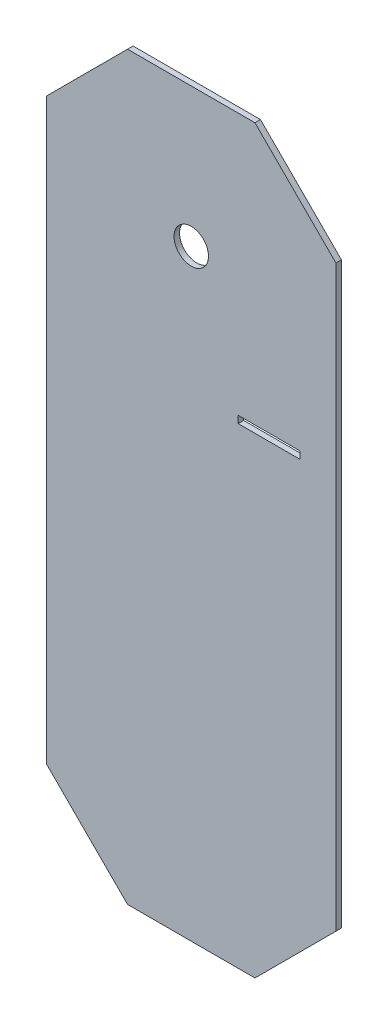
ISO-10303-21;
HEADER;
FILE_DESCRIPTION(('STEP AP214'),'2;1');
FILE_NAME('part.step','',(''),(''),'','','');
FILE_SCHEMA(('AUTOMOTIVE_DESIGN { 1 0 10303 214 1 1 1 1 }'));
ENDSEC;
DATA;
#1=APPLICATION_CONTEXT('core data for automotive mechanical design processes');
#2=APPLICATION_PROTOCOL_DEFINITION('international standard','automotive_design',2000,#1);
#3=PRODUCT_CONTEXT('',#1,'mechanical');
#4=PRODUCT('Part','Part','',(#3));
#5=PRODUCT_RELATED_PRODUCT_CATEGORY('part','',(#4));
#6=PRODUCT_DEFINITION_FORMATION('','',#4);
#7=PRODUCT_DEFINITION_CONTEXT('part definition',#1,'design');
#8=PRODUCT_DEFINITION('design','',#6,#7);
#9=PRODUCT_DEFINITION_SHAPE('','',#8);
#10=(LENGTH_UNIT() NAMED_UNIT(*) SI_UNIT(.MILLI.,.METRE.));
#11=(NAMED_UNIT(*) PLANE_ANGLE_UNIT() SI_UNIT($,.RADIAN.));
#12=(NAMED_UNIT(*) SI_UNIT($,.STERADIAN.) SOLID_ANGLE_UNIT());
#13=UNCERTAINTY_MEASURE_WITH_UNIT(LENGTH_MEASURE(1.E-05),#10,'distance_accuracy_value','');
#14=(GEOMETRIC_REPRESENTATION_CONTEXT(3) GLOBAL_UNCERTAINTY_ASSIGNED_CONTEXT((#13)) GLOBAL_UNIT_ASSIGNED_CONTEXT((#10,
#11,#12)) REPRESENTATION_CONTEXT('',''));
#15=CARTESIAN_POINT('',(0.,0.,0.));
#16=DIRECTION('',(0.,0.,1.));
#17=DIRECTION('',(1.,0.,0.));
#18=AXIS2_PLACEMENT_3D('',#15,#16,#17);
#19=CARTESIAN_POINT('',(-105.,640.774079522774,4.));
#20=DIRECTION('',(0.,0.,1.));
#21=DIRECTION('',(1.,0.,0.));
#22=AXIS2_PLACEMENT_3D('',#19,#20,#21);
#23=PLANE('',#22);
#24=DIRECTION('',(0.,1.,0.));
#25=VECTOR('',#24,1.);
#26=CARTESIAN_POINT('',(79.031307539577,445.574029202641,4.));
#27=LINE('',#26,#25);
#28=CARTESIAN_POINT('',(79.031307539577,445.574029202641,4.));
#29=VERTEX_POINT('',#28);
#30=CARTESIAN_POINT('',(79.031307539577,450.824029202642,4.));
#31=VERTEX_POINT('',#30);
#32=EDGE_CURVE('E45',#29,#31,#27,.T.);
#33=ORIENTED_EDGE('',*,*,#32,.F.);
#34=DIRECTION('',(1.,0.,0.));
#35=VECTOR('',#34,1.);
#36=CARTESIAN_POINT('',(34.031307539577,445.574029202641,4.));
#37=LINE('',#36,#35);
#38=CARTESIAN_POINT('',(34.031307539577,445.574029202641,4.));
#39=VERTEX_POINT('',#38);
#40=EDGE_CURVE('E137',#39,#29,#37,.T.);
#41=ORIENTED_EDGE('',*,*,#40,.F.);
#42=DIRECTION('',(0.,-1.,0.));
#43=VECTOR('',#42,1.);
#44=CARTESIAN_POINT('',(34.031307539577,445.574029202641,4.));
#45=LINE('',#44,#43);
#46=CARTESIAN_POINT('',(34.031307539577,450.824029202642,4.));
#47=VERTEX_POINT('',#46);
#48=EDGE_CURVE('E140',#47,#39,#45,.T.);
#49=ORIENTED_EDGE('',*,*,#48,.F.);
#50=DIRECTION('',(-1.,0.,0.));
#51=VECTOR('',#50,1.);
#52=CARTESIAN_POINT('',(34.031307539577,450.824029202642,4.));
#53=LINE('',#52,#51);
#54=EDGE_CURVE('E146',#31,#47,#53,.T.);
#55=ORIENTED_EDGE('',*,*,#54,.F.);
#56=EDGE_LOOP('',(#33,#41,#49,#55));
#57=FACE_BOUND('',#56,.T.);
#58=DIRECTION('',(0.,-1.,0.));
#59=VECTOR('',#58,1.);
#60=CARTESIAN_POINT('',(-105.,539.996445797992,4.));
#61=LINE('',#60,#59);
#62=CARTESIAN_POINT('',(-105.,581.996445797992,4.));
#63=VERTEX_POINT('',#62);
#64=CARTESIAN_POINT('',(-105.,161.993882509536,4.));
#65=VERTEX_POINT('',#64);
#66=EDGE_CURVE('E162',#63,#65,#61,.T.);
#67=ORIENTED_EDGE('',*,*,#66,.T.);
#68=DIRECTION('',(0.707106781186548,-0.707106781186547,0.));
#69=VECTOR('',#68,1.);
#70=CARTESIAN_POINT('',(-105.,161.993882509536,4.));
#71=LINE('',#70,#69);
#72=CARTESIAN_POINT('',(-46.2223662752187,103.216248784755,4.));
#73=VERTEX_POINT('',#72);
#74=EDGE_CURVE('E164',#65,#73,#71,.T.);
#75=ORIENTED_EDGE('',*,*,#74,.T.);
#76=DIRECTION('',(1.,0.,0.));
#77=VECTOR('',#76,1.);
#78=CARTESIAN_POINT('',(46.2223662752186,103.216248784755,4.));
#79=LINE('',#78,#77);
#80=CARTESIAN_POINT('',(46.2223662752186,103.216248784755,4.));
#81=VERTEX_POINT('',#80);
#82=EDGE_CURVE('E167',#73,#81,#79,.T.);
#83=ORIENTED_EDGE('',*,*,#82,.T.);
#84=DIRECTION('',(0.707106781186548,0.707106781186547,0.));
#85=VECTOR('',#84,1.);
#86=CARTESIAN_POINT('',(105.,161.993882509536,4.));
#87=LINE('',#86,#85);
#88=CARTESIAN_POINT('',(105.,161.993882509536,4.));
#89=VERTEX_POINT('',#88);
#90=EDGE_CURVE('E169',#81,#89,#87,.T.);
#91=ORIENTED_EDGE('',*,*,#90,.T.);
#92=DIRECTION('',(0.,1.,0.));
#93=VECTOR('',#92,1.);
#94=CARTESIAN_POINT('',(105.,203.993882509536,4.));
#95=LINE('',#94,#93);
#96=CARTESIAN_POINT('',(105.,581.996445797992,4.));
#97=VERTEX_POINT('',#96);
#98=EDGE_CURVE('E171',#89,#97,#95,.T.);
#99=ORIENTED_EDGE('',*,*,#98,.T.);
#100=DIRECTION('',(-0.707106781186548,0.707106781186547,0.));
#101=VECTOR('',#100,1.);
#102=CARTESIAN_POINT('',(105.,581.996445797992,4.));
#103=LINE('',#102,#101);
#104=CARTESIAN_POINT('',(46.2223662752186,640.774079522774,4.));
#105=VERTEX_POINT('',#104);
#106=EDGE_CURVE('E173',#97,#105,#103,.T.);
#107=ORIENTED_EDGE('',*,*,#106,.T.);
#108=DIRECTION('',(-1.,0.,0.));
#109=VECTOR('',#108,1.);
#110=CARTESIAN_POINT('',(46.2223662752186,640.774079522774,4.));
#111=LINE('',#110,#109);
#112=CARTESIAN_POINT('',(-46.2223662752187,640.774079522774,4.));
#113=VERTEX_POINT('',#112);
#114=EDGE_CURVE('E175',#105,#113,#111,.T.);
#115=ORIENTED_EDGE('',*,*,#114,.T.);
#116=DIRECTION('',(-0.707106781186548,-0.707106781186547,0.));
#117=VECTOR('',#116,1.);
#118=CARTESIAN_POINT('',(-105.,581.996445797992,4.));
#119=LINE('',#118,#117);
#120=EDGE_CURVE('E177',#113,#63,#119,.T.);
#121=ORIENTED_EDGE('',*,*,#120,.T.);
#122=EDGE_LOOP('',(#67,#75,#83,#91,#99,#107,#115,#121));
#123=FACE_BOUND('',#122,.T.);
#124=CARTESIAN_POINT('',(0.,539.996445797992,4.));
#125=DIRECTION('',(0.,0.,1.));
#126=DIRECTION('',(1.,0.,0.));
#127=AXIS2_PLACEMENT_3D('',#124,#125,#126);
#128=CIRCLE('',#127,12.5);
#129=CARTESIAN_POINT('',(12.5,539.996445797992,4.));
#130=VERTEX_POINT('',#129);
#131=EDGE_CURVE('E156',#130,#130,#128,.T.);
#132=ORIENTED_EDGE('',*,*,#131,.F.);
#133=EDGE_LOOP('',(#132));
#134=FACE_BOUND('',#133,.T.);
#135=ADVANCED_FACE('F30',(#57,#123,#134),#23,.T.);
#136=CARTESIAN_POINT('',(-105.,640.774079522774,0.));
#137=DIRECTION('',(0.,0.,1.));
#138=DIRECTION('',(1.,0.,0.));
#139=AXIS2_PLACEMENT_3D('',#136,#137,#138);
#140=PLANE('',#139);
#141=DIRECTION('',(1.,0.,0.));
#142=VECTOR('',#141,1.);
#143=CARTESIAN_POINT('',(34.031307539577,445.574029202641,0.));
#144=LINE('',#143,#142);
#145=CARTESIAN_POINT('',(34.031307539577,445.574029202641,0.));
#146=VERTEX_POINT('',#145);
#147=CARTESIAN_POINT('',(79.031307539577,445.574029202641,0.));
#148=VERTEX_POINT('',#147);
#149=EDGE_CURVE('E127',#146,#148,#144,.T.);
#150=ORIENTED_EDGE('',*,*,#149,.T.);
#151=DIRECTION('',(0.,1.,0.));
#152=VECTOR('',#151,1.);
#153=CARTESIAN_POINT('',(79.031307539577,445.574029202641,0.));
#154=LINE('',#153,#152);
#155=CARTESIAN_POINT('',(79.031307539577,450.824029202642,0.));
#156=VERTEX_POINT('',#155);
#157=EDGE_CURVE('E121',#148,#156,#154,.T.);
#158=ORIENTED_EDGE('',*,*,#157,.T.);
#159=DIRECTION('',(-1.,0.,0.));
#160=VECTOR('',#159,1.);
#161=CARTESIAN_POINT('',(34.031307539577,450.824029202642,0.));
#162=LINE('',#161,#160);
#163=CARTESIAN_POINT('',(34.031307539577,450.824029202642,0.));
#164=VERTEX_POINT('',#163);
#165=EDGE_CURVE('E130',#156,#164,#162,.T.);
#166=ORIENTED_EDGE('',*,*,#165,.T.);
#167=DIRECTION('',(0.,-1.,0.));
#168=VECTOR('',#167,1.);
#169=CARTESIAN_POINT('',(34.031307539577,445.574029202641,0.));
#170=LINE('',#169,#168);
#171=EDGE_CURVE('E53',#164,#146,#170,.T.);
#172=ORIENTED_EDGE('',*,*,#171,.T.);
#173=EDGE_LOOP('',(#150,#158,#166,#172));
#174=FACE_BOUND('',#173,.T.);
#175=DIRECTION('',(0.,-1.,0.));
#176=VECTOR('',#175,1.);
#177=CARTESIAN_POINT('',(-105.,203.993882509536,0.));
#178=LINE('',#177,#176);
#179=CARTESIAN_POINT('',(-105.,581.996445797992,0.));
#180=VERTEX_POINT('',#179);
#181=CARTESIAN_POINT('',(-105.,161.993882509536,0.));
#182=VERTEX_POINT('',#181);
#183=EDGE_CURVE('E159',#180,#182,#178,.T.);
#184=ORIENTED_EDGE('',*,*,#183,.F.);
#185=DIRECTION('',(-0.707106781186548,-0.707106781186547,0.));
#186=VECTOR('',#185,1.);
#187=CARTESIAN_POINT('',(-105.,581.996445797992,0.));
#188=LINE('',#187,#186);
#189=CARTESIAN_POINT('',(-46.2223662752187,640.774079522774,0.));
#190=VERTEX_POINT('',#189);
#191=EDGE_CURVE('E165',#190,#180,#188,.T.);
#192=ORIENTED_EDGE('',*,*,#191,.F.);
#193=DIRECTION('',(-1.,0.,0.));
#194=VECTOR('',#193,1.);
#195=CARTESIAN_POINT('',(46.2223662752186,640.774079522774,0.));
#196=LINE('',#195,#194);
#197=CARTESIAN_POINT('',(46.2223662752186,640.774079522774,0.));
#198=VERTEX_POINT('',#197);
#199=EDGE_CURVE('E192',#198,#190,#196,.T.);
#200=ORIENTED_EDGE('',*,*,#199,.F.);
#201=DIRECTION('',(-0.707106781186548,0.707106781186547,0.));
#202=VECTOR('',#201,1.);
#203=CARTESIAN_POINT('',(105.,581.996445797992,0.));
#204=LINE('',#203,#202);
#205=CARTESIAN_POINT('',(105.,581.996445797992,0.));
#206=VERTEX_POINT('',#205);
#207=EDGE_CURVE('E190',#206,#198,#204,.T.);
#208=ORIENTED_EDGE('',*,*,#207,.F.);
#209=DIRECTION('',(0.,1.,0.));
#210=VECTOR('',#209,1.);
#211=CARTESIAN_POINT('',(105.,539.996445797992,0.));
#212=LINE('',#211,#210);
#213=CARTESIAN_POINT('',(105.,161.993882509536,0.));
#214=VERTEX_POINT('',#213);
#215=EDGE_CURVE('E188',#214,#206,#212,.T.);
#216=ORIENTED_EDGE('',*,*,#215,.F.);
#217=DIRECTION('',(0.707106781186548,0.707106781186547,0.));
#218=VECTOR('',#217,1.);
#219=CARTESIAN_POINT('',(105.,161.993882509536,0.));
#220=LINE('',#219,#218);
#221=CARTESIAN_POINT('',(46.2223662752186,103.216248784755,0.));
#222=VERTEX_POINT('',#221);
#223=EDGE_CURVE('E185',#222,#214,#220,.T.);
#224=ORIENTED_EDGE('',*,*,#223,.F.);
#225=DIRECTION('',(1.,0.,0.));
#226=VECTOR('',#225,1.);
#227=CARTESIAN_POINT('',(46.2223662752186,103.216248784755,0.));
#228=LINE('',#227,#226);
#229=CARTESIAN_POINT('',(-46.2223662752187,103.216248784755,0.));
#230=VERTEX_POINT('',#229);
#231=EDGE_CURVE('E183',#230,#222,#228,.T.);
#232=ORIENTED_EDGE('',*,*,#231,.F.);
#233=DIRECTION('',(0.707106781186548,-0.707106781186547,0.));
#234=VECTOR('',#233,1.);
#235=CARTESIAN_POINT('',(-105.,161.993882509536,0.));
#236=LINE('',#235,#234);
#237=EDGE_CURVE('E181',#182,#230,#236,.T.);
#238=ORIENTED_EDGE('',*,*,#237,.F.);
#239=EDGE_LOOP('',(#184,#192,#200,#208,#216,#224,#232,#238));
#240=FACE_BOUND('',#239,.T.);
#241=CARTESIAN_POINT('',(0.,539.996445797992,0.));
#242=DIRECTION('',(0.,0.,1.));
#243=DIRECTION('',(1.,0.,0.));
#244=AXIS2_PLACEMENT_3D('',#241,#242,#243);
#245=CIRCLE('',#244,12.5);
#246=CARTESIAN_POINT('',(12.5,539.996445797992,0.));
#247=VERTEX_POINT('',#246);
#248=EDGE_CURVE('E152',#247,#247,#245,.T.);
#249=ORIENTED_EDGE('',*,*,#248,.T.);
#250=EDGE_LOOP('',(#249));
#251=FACE_BOUND('',#250,.T.);
#252=ADVANCED_FACE('F134',(#174,#240,#251),#140,.F.);
#253=CARTESIAN_POINT('',(-105.,203.993882509536,4.));
#254=DIRECTION('',(1.,0.,0.));
#255=DIRECTION('',(0.,1.,0.));
#256=AXIS2_PLACEMENT_3D('',#253,#254,#255);
#257=PLANE('',#256);
#258=ORIENTED_EDGE('',*,*,#183,.T.);
#259=DIRECTION('',(0.,0.,-1.));
#260=VECTOR('',#259,1.);
#261=CARTESIAN_POINT('',(-105.,161.993882509536,4.));
#262=LINE('',#261,#260);
#263=EDGE_CURVE('E11',#65,#182,#262,.T.);
#264=ORIENTED_EDGE('',*,*,#263,.F.);
#265=ORIENTED_EDGE('',*,*,#66,.F.);
#266=DIRECTION('',(0.,0.,-1.));
#267=VECTOR('',#266,1.);
#268=CARTESIAN_POINT('',(-105.,581.996445797992,4.));
#269=LINE('',#268,#267);
#270=EDGE_CURVE('E179',#63,#180,#269,.T.);
#271=ORIENTED_EDGE('',*,*,#270,.T.);
#272=EDGE_LOOP('',(#258,#264,#265,#271));
#273=FACE_BOUND('',#272,.T.);
#274=ADVANCED_FACE('F32',(#273),#257,.F.);
#275=CARTESIAN_POINT('',(-105.,161.993882509536,4.));
#276=DIRECTION('',(0.707106781186547,0.707106781186548,0.));
#277=DIRECTION('',(-0.707106781186548,0.707106781186547,0.));
#278=AXIS2_PLACEMENT_3D('',#275,#276,#277);
#279=PLANE('',#278);
#280=ORIENTED_EDGE('',*,*,#237,.T.);
#281=DIRECTION('',(0.,0.,-1.));
#282=VECTOR('',#281,1.);
#283=CARTESIAN_POINT('',(-46.2223662752187,103.216248784755,4.));
#284=LINE('',#283,#282);
#285=EDGE_CURVE('E38',#73,#230,#284,.T.);
#286=ORIENTED_EDGE('',*,*,#285,.F.);
#287=ORIENTED_EDGE('',*,*,#74,.F.);
#288=ORIENTED_EDGE('',*,*,#263,.T.);
#289=EDGE_LOOP('',(#280,#286,#287,#288));
#290=FACE_BOUND('',#289,.T.);
#291=ADVANCED_FACE('F239',(#290),#279,.F.);
#292=CARTESIAN_POINT('',(46.2223662752186,103.216248784755,4.));
#293=DIRECTION('',(0.,1.,0.));
#294=DIRECTION('',(0.,0.,1.));
#295=AXIS2_PLACEMENT_3D('',#292,#293,#294);
#296=PLANE('',#295);
#297=ORIENTED_EDGE('',*,*,#231,.T.);
#298=DIRECTION('',(0.,0.,-1.));
#299=VECTOR('',#298,1.);
#300=CARTESIAN_POINT('',(46.2223662752186,103.216248784755,4.));
#301=LINE('',#300,#299);
#302=EDGE_CURVE('E210',#81,#222,#301,.T.);
#303=ORIENTED_EDGE('',*,*,#302,.F.);
#304=ORIENTED_EDGE('',*,*,#82,.F.);
#305=ORIENTED_EDGE('',*,*,#285,.T.);
#306=EDGE_LOOP('',(#297,#303,#304,#305));
#307=FACE_BOUND('',#306,.T.);
#308=ADVANCED_FACE('F217',(#307),#296,.F.);
#309=CARTESIAN_POINT('',(105.,161.993882509536,4.));
#310=DIRECTION('',(-0.707106781186547,0.707106781186548,0.));
#311=DIRECTION('',(-0.707106781186548,-0.707106781186547,0.));
#312=AXIS2_PLACEMENT_3D('',#309,#310,#311);
#313=PLANE('',#312);
#314=ORIENTED_EDGE('',*,*,#223,.T.);
#315=DIRECTION('',(0.,0.,-1.));
#316=VECTOR('',#315,1.);
#317=CARTESIAN_POINT('',(105.,161.993882509536,4.));
#318=LINE('',#317,#316);
#319=EDGE_CURVE('E207',#89,#214,#318,.T.);
#320=ORIENTED_EDGE('',*,*,#319,.F.);
#321=ORIENTED_EDGE('',*,*,#90,.F.);
#322=ORIENTED_EDGE('',*,*,#302,.T.);
#323=EDGE_LOOP('',(#314,#320,#321,#322));
#324=FACE_BOUND('',#323,.T.);
#325=ADVANCED_FACE('F227',(#324),#313,.F.);
#326=CARTESIAN_POINT('',(105.,539.996445797992,4.));
#327=DIRECTION('',(-1.,0.,0.));
#328=DIRECTION('',(0.,-1.,0.));
#329=AXIS2_PLACEMENT_3D('',#326,#327,#328);
#330=PLANE('',#329);
#331=ORIENTED_EDGE('',*,*,#215,.T.);
#332=DIRECTION('',(0.,0.,-1.));
#333=VECTOR('',#332,1.);
#334=CARTESIAN_POINT('',(105.,581.996445797992,4.));
#335=LINE('',#334,#333);
#336=EDGE_CURVE('E204',#97,#206,#335,.T.);
#337=ORIENTED_EDGE('',*,*,#336,.F.);
#338=ORIENTED_EDGE('',*,*,#98,.F.);
#339=ORIENTED_EDGE('',*,*,#319,.T.);
#340=EDGE_LOOP('',(#331,#337,#338,#339));
#341=FACE_BOUND('',#340,.T.);
#342=ADVANCED_FACE('F231',(#341),#330,.F.);
#343=CARTESIAN_POINT('',(105.,581.996445797992,4.));
#344=DIRECTION('',(-0.707106781186547,-0.707106781186548,0.));
#345=DIRECTION('',(0.707106781186548,-0.707106781186547,0.));
#346=AXIS2_PLACEMENT_3D('',#343,#344,#345);
#347=PLANE('',#346);
#348=ORIENTED_EDGE('',*,*,#207,.T.);
#349=DIRECTION('',(0.,0.,-1.));
#350=VECTOR('',#349,1.);
#351=CARTESIAN_POINT('',(46.2223662752186,640.774079522774,4.));
#352=LINE('',#351,#350);
#353=EDGE_CURVE('E201',#105,#198,#352,.T.);
#354=ORIENTED_EDGE('',*,*,#353,.F.);
#355=ORIENTED_EDGE('',*,*,#106,.F.);
#356=ORIENTED_EDGE('',*,*,#336,.T.);
#357=EDGE_LOOP('',(#348,#354,#355,#356));
#358=FACE_BOUND('',#357,.T.);
#359=ADVANCED_FACE('F252',(#358),#347,.F.);
#360=CARTESIAN_POINT('',(46.2223662752186,640.774079522774,4.));
#361=DIRECTION('',(0.,-1.,0.));
#362=DIRECTION('',(0.,0.,-1.));
#363=AXIS2_PLACEMENT_3D('',#360,#361,#362);
#364=PLANE('',#363);
#365=ORIENTED_EDGE('',*,*,#199,.T.);
#366=DIRECTION('',(0.,0.,-1.));
#367=VECTOR('',#366,1.);
#368=CARTESIAN_POINT('',(-46.2223662752187,640.774079522774,4.));
#369=LINE('',#368,#367);
#370=EDGE_CURVE('E198',#113,#190,#369,.T.);
#371=ORIENTED_EDGE('',*,*,#370,.F.);
#372=ORIENTED_EDGE('',*,*,#114,.F.);
#373=ORIENTED_EDGE('',*,*,#353,.T.);
#374=EDGE_LOOP('',(#365,#371,#372,#373));
#375=FACE_BOUND('',#374,.T.);
#376=ADVANCED_FACE('F250',(#375),#364,.F.);
#377=CARTESIAN_POINT('',(-105.,581.996445797992,4.));
#378=DIRECTION('',(0.707106781186547,-0.707106781186548,0.));
#379=DIRECTION('',(0.707106781186548,0.707106781186547,0.));
#380=AXIS2_PLACEMENT_3D('',#377,#378,#379);
#381=PLANE('',#380);
#382=ORIENTED_EDGE('',*,*,#191,.T.);
#383=ORIENTED_EDGE('',*,*,#270,.F.);
#384=ORIENTED_EDGE('',*,*,#120,.F.);
#385=ORIENTED_EDGE('',*,*,#370,.T.);
#386=EDGE_LOOP('',(#382,#383,#384,#385));
#387=FACE_BOUND('',#386,.T.);
#388=ADVANCED_FACE('F245',(#387),#381,.F.);
#389=CARTESIAN_POINT('',(0.,539.996445797992,4.));
#390=DIRECTION('',(0.,0.,-1.));
#391=DIRECTION('',(-1.,0.,0.));
#392=AXIS2_PLACEMENT_3D('',#389,#390,#391);
#393=CYLINDRICAL_SURFACE('',#392,12.5);
#394=ORIENTED_EDGE('',*,*,#131,.T.);
#395=EDGE_LOOP('',(#394));
#396=FACE_BOUND('',#395,.T.);
#397=ORIENTED_EDGE('',*,*,#248,.F.);
#398=EDGE_LOOP('',(#397));
#399=FACE_BOUND('',#398,.T.);
#400=ADVANCED_FACE('F270',(#396,#399),#393,.F.);
#401=CARTESIAN_POINT('',(79.031307539577,445.574029202641,0.));
#402=DIRECTION('',(1.,0.,0.));
#403=DIRECTION('',(0.,0.,-1.));
#404=AXIS2_PLACEMENT_3D('',#401,#402,#403);
#405=PLANE('',#404);
#406=ORIENTED_EDGE('',*,*,#32,.T.);
#407=DIRECTION('',(0.,0.,1.));
#408=VECTOR('',#407,1.);
#409=CARTESIAN_POINT('',(79.031307539577,450.824029202642,0.));
#410=LINE('',#409,#408);
#411=EDGE_CURVE('E117',#156,#31,#410,.T.);
#412=ORIENTED_EDGE('',*,*,#411,.F.);
#413=ORIENTED_EDGE('',*,*,#157,.F.);
#414=DIRECTION('',(0.,0.,1.));
#415=VECTOR('',#414,1.);
#416=CARTESIAN_POINT('',(79.031307539577,445.574029202641,0.));
#417=LINE('',#416,#415);
#418=EDGE_CURVE('E150',#148,#29,#417,.T.);
#419=ORIENTED_EDGE('',*,*,#418,.T.);
#420=EDGE_LOOP('',(#406,#412,#413,#419));
#421=FACE_BOUND('',#420,.T.);
#422=ADVANCED_FACE('F119',(#421),#405,.F.);
#423=CARTESIAN_POINT('',(34.031307539577,445.574029202641,0.));
#424=DIRECTION('',(0.,-1.,0.));
#425=DIRECTION('',(0.,0.,-1.));
#426=AXIS2_PLACEMENT_3D('',#423,#424,#425);
#427=PLANE('',#426);
#428=ORIENTED_EDGE('',*,*,#40,.T.);
#429=ORIENTED_EDGE('',*,*,#418,.F.);
#430=ORIENTED_EDGE('',*,*,#149,.F.);
#431=DIRECTION('',(0.,0.,1.));
#432=VECTOR('',#431,1.);
#433=CARTESIAN_POINT('',(34.031307539577,445.574029202641,0.));
#434=LINE('',#433,#432);
#435=EDGE_CURVE('E153',#146,#39,#434,.T.);
#436=ORIENTED_EDGE('',*,*,#435,.T.);
#437=EDGE_LOOP('',(#428,#429,#430,#436));
#438=FACE_BOUND('',#437,.T.);
#439=ADVANCED_FACE('F280',(#438),#427,.F.);
#440=CARTESIAN_POINT('',(34.031307539577,445.574029202641,0.));
#441=DIRECTION('',(-1.,0.,0.));
#442=DIRECTION('',(0.,0.,1.));
#443=AXIS2_PLACEMENT_3D('',#440,#441,#442);
#444=PLANE('',#443);
#445=ORIENTED_EDGE('',*,*,#48,.T.);
#446=ORIENTED_EDGE('',*,*,#435,.F.);
#447=ORIENTED_EDGE('',*,*,#171,.F.);
#448=DIRECTION('',(0.,0.,1.));
#449=VECTOR('',#448,1.);
#450=CARTESIAN_POINT('',(34.031307539577,450.824029202642,0.));
#451=LINE('',#450,#449);
#452=EDGE_CURVE('E126',#164,#47,#451,.T.);
#453=ORIENTED_EDGE('',*,*,#452,.T.);
#454=EDGE_LOOP('',(#445,#446,#447,#453));
#455=FACE_BOUND('',#454,.T.);
#456=ADVANCED_FACE('F287',(#455),#444,.F.);
#457=CARTESIAN_POINT('',(34.031307539577,450.824029202642,0.));
#458=DIRECTION('',(0.,1.,0.));
#459=DIRECTION('',(0.,0.,1.));
#460=AXIS2_PLACEMENT_3D('',#457,#458,#459);
#461=PLANE('',#460);
#462=ORIENTED_EDGE('',*,*,#54,.T.);
#463=ORIENTED_EDGE('',*,*,#452,.F.);
#464=ORIENTED_EDGE('',*,*,#165,.F.);
#465=ORIENTED_EDGE('',*,*,#411,.T.);
#466=EDGE_LOOP('',(#462,#463,#464,#465));
#467=FACE_BOUND('',#466,.T.);
#468=ADVANCED_FACE('F131',(#467),#461,.F.);
#469=CLOSED_SHELL('',(#135,#252,#274,#291,#308,#325,#342,#359,#376,#388,#400,#422,#439,#456,#468));
#470=MANIFOLD_SOLID_BREP('B2',#469);
#471=ADVANCED_BREP_SHAPE_REPRESENTATION('',(#18,#470),#14);
#472=SHAPE_DEFINITION_REPRESENTATION(#9,#471);
ENDSEC;
END-ISO-10303-21;
